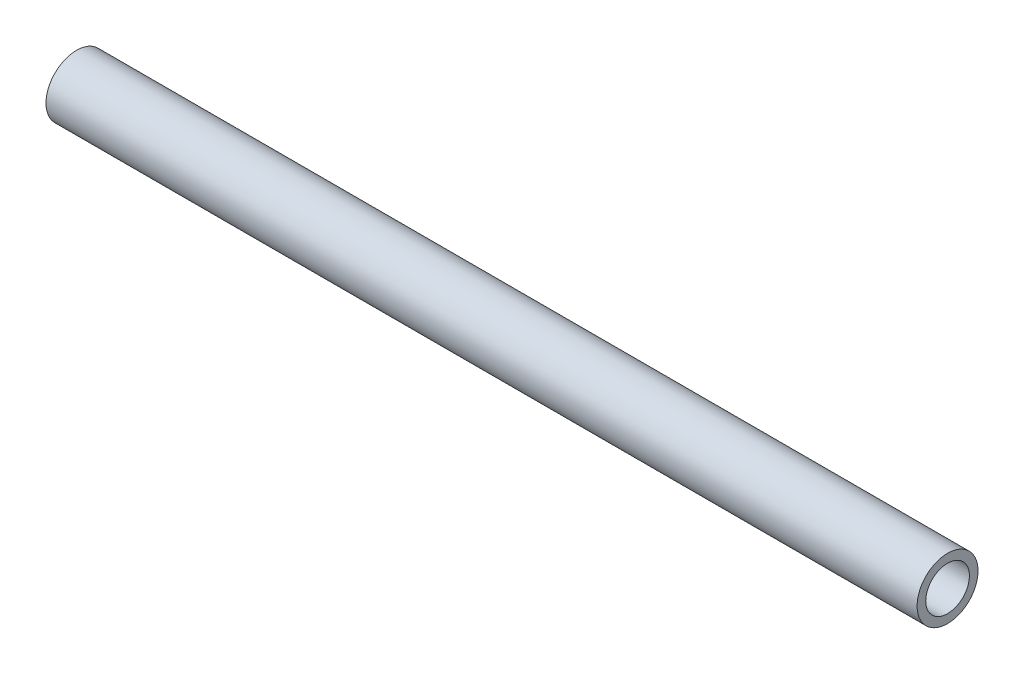
ISO-10303-21;
HEADER;
FILE_DESCRIPTION(('STEP AP214'),'2;1');
FILE_NAME('part.step','',(''),(''),'','','');
FILE_SCHEMA(('AUTOMOTIVE_DESIGN { 1 0 10303 214 1 1 1 1 }'));
ENDSEC;
DATA;
#1=APPLICATION_CONTEXT('core data for automotive mechanical design processes');
#2=APPLICATION_PROTOCOL_DEFINITION('international standard','automotive_design',2000,#1);
#3=PRODUCT_CONTEXT('',#1,'mechanical');
#4=PRODUCT('Part','Part','',(#3));
#5=PRODUCT_RELATED_PRODUCT_CATEGORY('part','',(#4));
#6=PRODUCT_DEFINITION_FORMATION('','',#4);
#7=PRODUCT_DEFINITION_CONTEXT('part definition',#1,'design');
#8=PRODUCT_DEFINITION('design','',#6,#7);
#9=PRODUCT_DEFINITION_SHAPE('','',#8);
#10=(LENGTH_UNIT() NAMED_UNIT(*) SI_UNIT(.MILLI.,.METRE.));
#11=(NAMED_UNIT(*) PLANE_ANGLE_UNIT() SI_UNIT($,.RADIAN.));
#12=(NAMED_UNIT(*) SI_UNIT($,.STERADIAN.) SOLID_ANGLE_UNIT());
#13=UNCERTAINTY_MEASURE_WITH_UNIT(LENGTH_MEASURE(1.E-05),#10,'distance_accuracy_value','');
#14=(GEOMETRIC_REPRESENTATION_CONTEXT(3) GLOBAL_UNCERTAINTY_ASSIGNED_CONTEXT((#13)) GLOBAL_UNIT_ASSIGNED_CONTEXT((#10,
#11,#12)) REPRESENTATION_CONTEXT('',''));
#15=CARTESIAN_POINT('',(0.,0.,0.));
#16=DIRECTION('',(0.,0.,1.));
#17=DIRECTION('',(1.,0.,0.));
#18=AXIS2_PLACEMENT_3D('',#15,#16,#17);
#19=CARTESIAN_POINT('',(304.8,0.,0.));
#20=DIRECTION('',(1.,0.,0.));
#21=DIRECTION('',(0.,0.,-1.));
#22=AXIS2_PLACEMENT_3D('',#19,#20,#21);
#23=PLANE('',#22);
#24=CARTESIAN_POINT('',(304.8,0.,0.));
#25=DIRECTION('',(1.,0.,0.));
#26=DIRECTION('',(0.,0.,-1.));
#27=AXIS2_PLACEMENT_3D('',#24,#25,#26);
#28=CIRCLE('',#27,10.668);
#29=CARTESIAN_POINT('',(304.8,0.,10.668));
#30=VERTEX_POINT('',#29);
#31=EDGE_CURVE('E10',#30,#30,#28,.T.);
#32=ORIENTED_EDGE('',*,*,#31,.T.);
#33=EDGE_LOOP('',(#32));
#34=FACE_BOUND('',#33,.T.);
#35=CARTESIAN_POINT('',(304.8,0.,0.));
#36=DIRECTION('',(1.,0.,0.));
#37=DIRECTION('',(0.,0.,-1.));
#38=AXIS2_PLACEMENT_3D('',#35,#36,#37);
#39=CIRCLE('',#38,7.6454);
#40=CARTESIAN_POINT('',(304.8,0.,7.6454));
#41=VERTEX_POINT('',#40);
#42=EDGE_CURVE('E42',#41,#41,#39,.T.);
#43=ORIENTED_EDGE('',*,*,#42,.F.);
#44=EDGE_LOOP('',(#43));
#45=FACE_BOUND('',#44,.T.);
#46=ADVANCED_FACE('F31',(#34,#45),#23,.T.);
#47=CARTESIAN_POINT('',(0.,0.,0.));
#48=DIRECTION('',(1.,0.,0.));
#49=DIRECTION('',(0.,0.,-1.));
#50=AXIS2_PLACEMENT_3D('',#47,#48,#49);
#51=PLANE('',#50);
#52=CARTESIAN_POINT('',(0.,0.,0.));
#53=DIRECTION('',(1.,0.,0.));
#54=DIRECTION('',(0.,0.,-1.));
#55=AXIS2_PLACEMENT_3D('',#52,#53,#54);
#56=CIRCLE('',#55,10.668);
#57=CARTESIAN_POINT('',(0.,0.,10.668));
#58=VERTEX_POINT('',#57);
#59=EDGE_CURVE('E35',#58,#58,#56,.T.);
#60=ORIENTED_EDGE('',*,*,#59,.F.);
#61=EDGE_LOOP('',(#60));
#62=FACE_BOUND('',#61,.T.);
#63=CARTESIAN_POINT('',(0.,0.,0.));
#64=DIRECTION('',(1.,0.,0.));
#65=DIRECTION('',(0.,0.,-1.));
#66=AXIS2_PLACEMENT_3D('',#63,#64,#65);
#67=CIRCLE('',#66,7.6454);
#68=CARTESIAN_POINT('',(0.,0.,7.6454));
#69=VERTEX_POINT('',#68);
#70=EDGE_CURVE('E44',#69,#69,#67,.T.);
#71=ORIENTED_EDGE('',*,*,#70,.T.);
#72=EDGE_LOOP('',(#71));
#73=FACE_BOUND('',#72,.T.);
#74=ADVANCED_FACE('F54',(#62,#73),#51,.F.);
#75=CARTESIAN_POINT('',(304.8,0.,0.));
#76=DIRECTION('',(-1.,0.,0.));
#77=DIRECTION('',(0.,0.,1.));
#78=AXIS2_PLACEMENT_3D('',#75,#76,#77);
#79=CYLINDRICAL_SURFACE('',#78,10.668);
#80=CARTESIAN_POINT('',(304.8,0.,10.668));
#81=CARTESIAN_POINT('',(301.625,0.,10.668));
#82=CARTESIAN_POINT('',(298.45,0.,10.668));
#83=CARTESIAN_POINT('',(292.1,0.,10.668));
#84=CARTESIAN_POINT('',(288.925,0.,10.668));
#85=CARTESIAN_POINT('',(282.575,0.,10.668));
#86=CARTESIAN_POINT('',(279.4,0.,10.668));
#87=CARTESIAN_POINT('',(273.05,0.,10.668));
#88=CARTESIAN_POINT('',(269.875,0.,10.668));
#89=CARTESIAN_POINT('',(263.525,0.,10.668));
#90=CARTESIAN_POINT('',(260.35,0.,10.668));
#91=CARTESIAN_POINT('',(254.,0.,10.668));
#92=CARTESIAN_POINT('',(250.825,0.,10.668));
#93=CARTESIAN_POINT('',(244.475,0.,10.668));
#94=CARTESIAN_POINT('',(241.3,0.,10.668));
#95=CARTESIAN_POINT('',(234.95,0.,10.668));
#96=CARTESIAN_POINT('',(231.775,0.,10.668));
#97=CARTESIAN_POINT('',(225.425,0.,10.668));
#98=CARTESIAN_POINT('',(222.25,0.,10.668));
#99=CARTESIAN_POINT('',(215.9,0.,10.668));
#100=CARTESIAN_POINT('',(212.725,0.,10.668));
#101=CARTESIAN_POINT('',(206.375,0.,10.668));
#102=CARTESIAN_POINT('',(203.2,0.,10.668));
#103=CARTESIAN_POINT('',(196.85,0.,10.668));
#104=CARTESIAN_POINT('',(193.675,0.,10.668));
#105=CARTESIAN_POINT('',(187.325,0.,10.668));
#106=CARTESIAN_POINT('',(184.15,0.,10.668));
#107=CARTESIAN_POINT('',(177.8,0.,10.668));
#108=CARTESIAN_POINT('',(174.625,0.,10.668));
#109=CARTESIAN_POINT('',(168.275,0.,10.668));
#110=CARTESIAN_POINT('',(165.1,0.,10.668));
#111=CARTESIAN_POINT('',(158.75,0.,10.668));
#112=CARTESIAN_POINT('',(155.575,0.,10.668));
#113=CARTESIAN_POINT('',(149.225,0.,10.668));
#114=CARTESIAN_POINT('',(146.05,0.,10.668));
#115=CARTESIAN_POINT('',(139.7,0.,10.668));
#116=CARTESIAN_POINT('',(136.525,0.,10.668));
#117=CARTESIAN_POINT('',(130.175,0.,10.668));
#118=CARTESIAN_POINT('',(127.,0.,10.668));
#119=CARTESIAN_POINT('',(120.65,0.,10.668));
#120=CARTESIAN_POINT('',(117.475,0.,10.668));
#121=CARTESIAN_POINT('',(111.125,0.,10.668));
#122=CARTESIAN_POINT('',(107.95,0.,10.668));
#123=CARTESIAN_POINT('',(101.6,0.,10.668));
#124=CARTESIAN_POINT('',(98.425,0.,10.668));
#125=CARTESIAN_POINT('',(92.075,0.,10.668));
#126=CARTESIAN_POINT('',(88.9,0.,10.668));
#127=CARTESIAN_POINT('',(82.55,0.,10.668));
#128=CARTESIAN_POINT('',(79.375,0.,10.668));
#129=CARTESIAN_POINT('',(73.025,0.,10.668));
#130=CARTESIAN_POINT('',(69.85,0.,10.668));
#131=CARTESIAN_POINT('',(63.5,0.,10.668));
#132=CARTESIAN_POINT('',(60.325,0.,10.668));
#133=CARTESIAN_POINT('',(53.975,0.,10.668));
#134=CARTESIAN_POINT('',(50.8,0.,10.668));
#135=CARTESIAN_POINT('',(44.45,0.,10.668));
#136=CARTESIAN_POINT('',(41.275,0.,10.668));
#137=CARTESIAN_POINT('',(34.925,0.,10.668));
#138=CARTESIAN_POINT('',(31.75,0.,10.668));
#139=CARTESIAN_POINT('',(25.4,0.,10.668));
#140=CARTESIAN_POINT('',(22.225,0.,10.668));
#141=CARTESIAN_POINT('',(15.875,0.,10.668));
#142=CARTESIAN_POINT('',(12.7,0.,10.668));
#143=CARTESIAN_POINT('',(6.35,0.,10.668));
#144=CARTESIAN_POINT('',(3.175,0.,10.668));
#145=CARTESIAN_POINT('',(0.,0.,10.668));
#146=B_SPLINE_CURVE_WITH_KNOTS('',3,(#80,#81,#82,#83,#84,#85,#86,#87,#88,#89,#90,#91,#92,#93,
#94,#95,#96,#97,#98,#99,#100,#101,#102,#103,#104,#105,#106,#107,#108,#109,#110,#111,#112,#113,
#114,#115,#116,#117,#118,#119,#120,#121,#122,#123,#124,#125,#126,#127,#128,#129,#130,#131,#132,
#133,#134,#135,#136,#137,#138,#139,#140,#141,#142,#143,#144,#145),.UNSPECIFIED.,.F.,.F.,(4,2,2,
2,2,2,2,2,2,2,2,2,2,2,2,2,2,2,2,2,2,2,2,2,2,2,2,2,2,2,2,2,4),(0.,9.52500000000001,19.05,28.575,
38.1,47.625,57.15,66.675,76.2,85.7250000000001,95.2500000000001,104.775,114.3,123.825,133.35,
142.875,152.4,161.925,171.45,180.975,190.5,200.025,209.55,219.075,228.6,238.125,247.65,257.175,
266.7,276.225,285.75,295.275,304.8),.UNSPECIFIED.);
#147=EDGE_CURVE('BSEAM33',#30,#58,#146,.T.);
#148=ORIENTED_EDGE('',*,*,#31,.F.);
#149=ORIENTED_EDGE('',*,*,#59,.T.);
#150=ORIENTED_EDGE('',*,*,#147,.T.);
#151=ORIENTED_EDGE('',*,*,#147,.F.);
#152=EDGE_LOOP('',(#148,#150,#149,#151));
#153=FACE_BOUND('',#152,.T.);
#154=ADVANCED_FACE('F33',(#153),#79,.T.);
#155=CARTESIAN_POINT('',(304.8,0.,0.));
#156=DIRECTION('',(-1.,0.,0.));
#157=DIRECTION('',(0.,0.,1.));
#158=AXIS2_PLACEMENT_3D('',#155,#156,#157);
#159=CYLINDRICAL_SURFACE('',#158,7.6454);
#160=CARTESIAN_POINT('',(304.8,0.,7.6454));
#161=CARTESIAN_POINT('',(301.625,0.,7.6454));
#162=CARTESIAN_POINT('',(298.45,0.,7.6454));
#163=CARTESIAN_POINT('',(292.1,0.,7.6454));
#164=CARTESIAN_POINT('',(288.925,0.,7.6454));
#165=CARTESIAN_POINT('',(282.575,0.,7.6454));
#166=CARTESIAN_POINT('',(279.4,0.,7.6454));
#167=CARTESIAN_POINT('',(273.05,0.,7.6454));
#168=CARTESIAN_POINT('',(269.875,0.,7.6454));
#169=CARTESIAN_POINT('',(263.525,0.,7.6454));
#170=CARTESIAN_POINT('',(260.35,0.,7.6454));
#171=CARTESIAN_POINT('',(254.,0.,7.6454));
#172=CARTESIAN_POINT('',(250.825,0.,7.6454));
#173=CARTESIAN_POINT('',(244.475,0.,7.6454));
#174=CARTESIAN_POINT('',(241.3,0.,7.6454));
#175=CARTESIAN_POINT('',(234.95,0.,7.6454));
#176=CARTESIAN_POINT('',(231.775,0.,7.6454));
#177=CARTESIAN_POINT('',(225.425,0.,7.6454));
#178=CARTESIAN_POINT('',(222.25,0.,7.6454));
#179=CARTESIAN_POINT('',(215.9,0.,7.6454));
#180=CARTESIAN_POINT('',(212.725,0.,7.6454));
#181=CARTESIAN_POINT('',(206.375,0.,7.6454));
#182=CARTESIAN_POINT('',(203.2,0.,7.6454));
#183=CARTESIAN_POINT('',(196.85,0.,7.6454));
#184=CARTESIAN_POINT('',(193.675,0.,7.6454));
#185=CARTESIAN_POINT('',(187.325,0.,7.6454));
#186=CARTESIAN_POINT('',(184.15,0.,7.6454));
#187=CARTESIAN_POINT('',(177.8,0.,7.6454));
#188=CARTESIAN_POINT('',(174.625,0.,7.6454));
#189=CARTESIAN_POINT('',(168.275,0.,7.6454));
#190=CARTESIAN_POINT('',(165.1,0.,7.6454));
#191=CARTESIAN_POINT('',(158.75,0.,7.6454));
#192=CARTESIAN_POINT('',(155.575,0.,7.6454));
#193=CARTESIAN_POINT('',(149.225,0.,7.6454));
#194=CARTESIAN_POINT('',(146.05,0.,7.6454));
#195=CARTESIAN_POINT('',(139.7,0.,7.6454));
#196=CARTESIAN_POINT('',(136.525,0.,7.6454));
#197=CARTESIAN_POINT('',(130.175,0.,7.6454));
#198=CARTESIAN_POINT('',(127.,0.,7.6454));
#199=CARTESIAN_POINT('',(120.65,0.,7.6454));
#200=CARTESIAN_POINT('',(117.475,0.,7.6454));
#201=CARTESIAN_POINT('',(111.125,0.,7.6454));
#202=CARTESIAN_POINT('',(107.95,0.,7.6454));
#203=CARTESIAN_POINT('',(101.6,0.,7.6454));
#204=CARTESIAN_POINT('',(98.425,0.,7.6454));
#205=CARTESIAN_POINT('',(92.075,0.,7.6454));
#206=CARTESIAN_POINT('',(88.9,0.,7.6454));
#207=CARTESIAN_POINT('',(82.55,0.,7.6454));
#208=CARTESIAN_POINT('',(79.375,0.,7.6454));
#209=CARTESIAN_POINT('',(73.025,0.,7.6454));
#210=CARTESIAN_POINT('',(69.85,0.,7.6454));
#211=CARTESIAN_POINT('',(63.5,0.,7.6454));
#212=CARTESIAN_POINT('',(60.325,0.,7.6454));
#213=CARTESIAN_POINT('',(53.975,0.,7.6454));
#214=CARTESIAN_POINT('',(50.8,0.,7.6454));
#215=CARTESIAN_POINT('',(44.45,0.,7.6454));
#216=CARTESIAN_POINT('',(41.275,0.,7.6454));
#217=CARTESIAN_POINT('',(34.925,0.,7.6454));
#218=CARTESIAN_POINT('',(31.75,0.,7.6454));
#219=CARTESIAN_POINT('',(25.4,0.,7.6454));
#220=CARTESIAN_POINT('',(22.225,0.,7.6454));
#221=CARTESIAN_POINT('',(15.875,0.,7.6454));
#222=CARTESIAN_POINT('',(12.7,0.,7.6454));
#223=CARTESIAN_POINT('',(6.35,0.,7.6454));
#224=CARTESIAN_POINT('',(3.175,0.,7.6454));
#225=CARTESIAN_POINT('',(0.,0.,7.6454));
#226=B_SPLINE_CURVE_WITH_KNOTS('',3,(#160,#161,#162,#163,#164,#165,#166,#167,#168,#169,#170,
#171,#172,#173,#174,#175,#176,#177,#178,#179,#180,#181,#182,#183,#184,#185,#186,#187,#188,#189,
#190,#191,#192,#193,#194,#195,#196,#197,#198,#199,#200,#201,#202,#203,#204,#205,#206,#207,#208,
#209,#210,#211,#212,#213,#214,#215,#216,#217,#218,#219,#220,#221,#222,#223,#224,#225),
.UNSPECIFIED.,.F.,.F.,(4,2,2,2,2,2,2,2,2,2,2,2,2,2,2,2,2,2,2,2,2,2,2,2,2,2,2,2,2,2,2,2,4),(0.,
9.52499999999995,19.05,28.575,38.1,47.625,57.15,66.675,76.2,85.725,95.2499999999999,104.775,
114.3,123.825,133.35,142.875,152.4,161.925,171.45,180.975,190.5,200.025,209.55,219.075,228.6,
238.125,247.65,257.175,266.7,276.225,285.75,295.275,304.8),.UNSPECIFIED.);
#227=EDGE_CURVE('BSEAM50',#41,#69,#226,.T.);
#228=ORIENTED_EDGE('',*,*,#42,.T.);
#229=ORIENTED_EDGE('',*,*,#70,.F.);
#230=ORIENTED_EDGE('',*,*,#227,.T.);
#231=ORIENTED_EDGE('',*,*,#227,.F.);
#232=EDGE_LOOP('',(#228,#230,#229,#231));
#233=FACE_BOUND('',#232,.T.);
#234=ADVANCED_FACE('F50',(#233),#159,.F.);
#235=CLOSED_SHELL('',(#46,#74,#154,#234));
#236=MANIFOLD_SOLID_BREP('B2',#235);
#237=ADVANCED_BREP_SHAPE_REPRESENTATION('',(#18,#236),#14);
#238=SHAPE_DEFINITION_REPRESENTATION(#9,#237);
ENDSEC;
END-ISO-10303-21;
